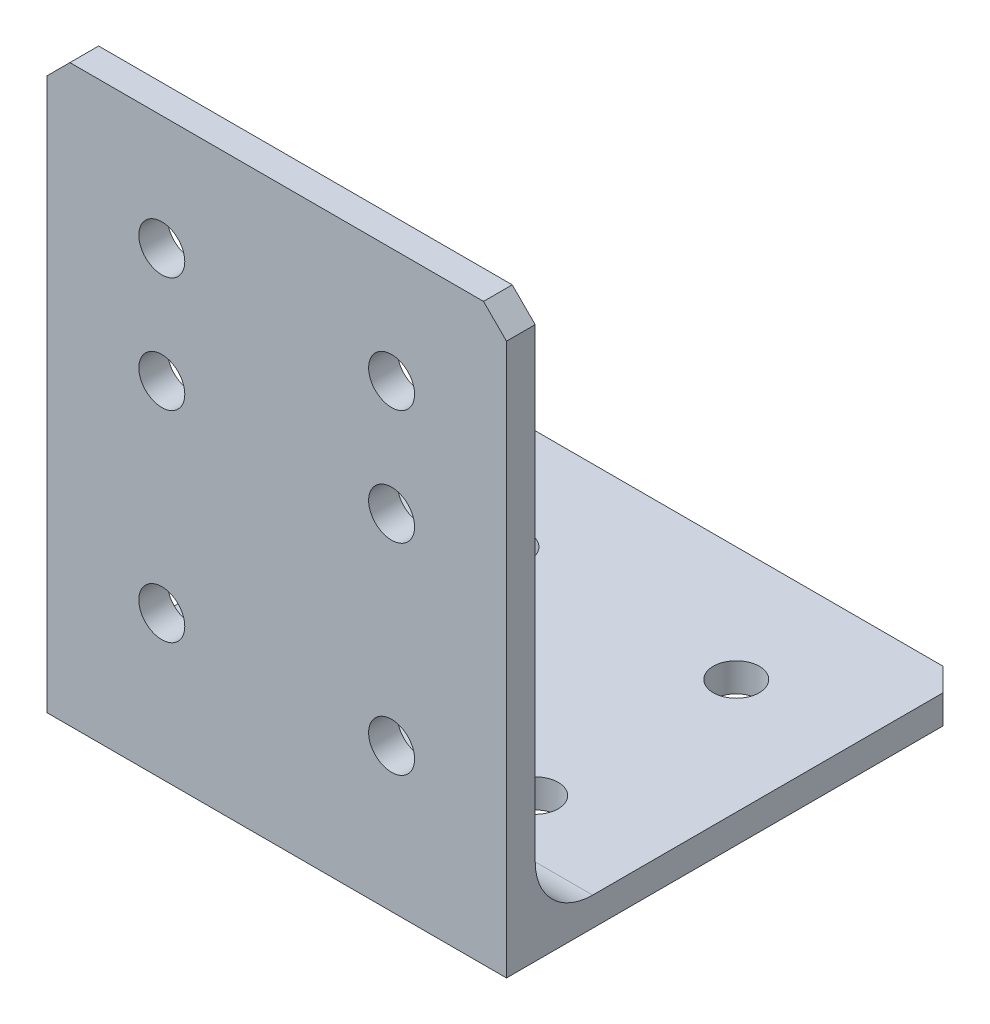
ISO-10303-21;
HEADER;
FILE_DESCRIPTION(('STEP AP214'),'2;1');
FILE_NAME('part.step','',(''),(''),'','','');
FILE_SCHEMA(('AUTOMOTIVE_DESIGN { 1 0 10303 214 1 1 1 1 }'));
ENDSEC;
DATA;
#1=APPLICATION_CONTEXT('core data for automotive mechanical design processes');
#2=APPLICATION_PROTOCOL_DEFINITION('international standard','automotive_design',2000,#1);
#3=PRODUCT_CONTEXT('',#1,'mechanical');
#4=PRODUCT('Part','Part','',(#3));
#5=PRODUCT_RELATED_PRODUCT_CATEGORY('part','',(#4));
#6=PRODUCT_DEFINITION_FORMATION('','',#4);
#7=PRODUCT_DEFINITION_CONTEXT('part definition',#1,'design');
#8=PRODUCT_DEFINITION('design','',#6,#7);
#9=PRODUCT_DEFINITION_SHAPE('','',#8);
#10=(LENGTH_UNIT() NAMED_UNIT(*) SI_UNIT(.MILLI.,.METRE.));
#11=(NAMED_UNIT(*) PLANE_ANGLE_UNIT() SI_UNIT($,.RADIAN.));
#12=(NAMED_UNIT(*) SI_UNIT($,.STERADIAN.) SOLID_ANGLE_UNIT());
#13=UNCERTAINTY_MEASURE_WITH_UNIT(LENGTH_MEASURE(1.E-05),#10,'distance_accuracy_value','');
#14=(GEOMETRIC_REPRESENTATION_CONTEXT(3) GLOBAL_UNCERTAINTY_ASSIGNED_CONTEXT((#13)) GLOBAL_UNIT_ASSIGNED_CONTEXT((#10,
#11,#12)) REPRESENTATION_CONTEXT('',''));
#15=CARTESIAN_POINT('',(0.,0.,0.));
#16=DIRECTION('',(0.,0.,1.));
#17=DIRECTION('',(1.,0.,0.));
#18=AXIS2_PLACEMENT_3D('',#15,#16,#17);
#19=CARTESIAN_POINT('',(50.8,0.,-50.8));
#20=DIRECTION('',(0.,1.,0.));
#21=DIRECTION('',(0.,0.,1.));
#22=AXIS2_PLACEMENT_3D('',#19,#20,#21);
#23=PLANE('',#22);
#24=CARTESIAN_POINT('',(38.1,0.,-15.875));
#25=DIRECTION('',(0.,-1.,0.));
#26=DIRECTION('',(0.,0.,-1.));
#27=AXIS2_PLACEMENT_3D('',#24,#25,#26);
#28=CIRCLE('',#27,2.54);
#29=CARTESIAN_POINT('',(38.1,0.,-18.415));
#30=VERTEX_POINT('',#29);
#31=EDGE_CURVE('E344',#30,#30,#28,.T.);
#32=ORIENTED_EDGE('',*,*,#31,.F.);
#33=EDGE_LOOP('',(#32));
#34=FACE_BOUND('',#33,.T.);
#35=CARTESIAN_POINT('',(12.7,0.,-38.1));
#36=DIRECTION('',(0.,-1.,0.));
#37=DIRECTION('',(0.,0.,-1.));
#38=AXIS2_PLACEMENT_3D('',#35,#36,#37);
#39=CIRCLE('',#38,2.54);
#40=CARTESIAN_POINT('',(12.7,0.,-40.64));
#41=VERTEX_POINT('',#40);
#42=EDGE_CURVE('E341',#41,#41,#39,.T.);
#43=ORIENTED_EDGE('',*,*,#42,.F.);
#44=EDGE_LOOP('',(#43));
#45=FACE_BOUND('',#44,.T.);
#46=CARTESIAN_POINT('',(12.7,0.,-15.875));
#47=DIRECTION('',(0.,-1.,0.));
#48=DIRECTION('',(0.,0.,-1.));
#49=AXIS2_PLACEMENT_3D('',#46,#47,#48);
#50=CIRCLE('',#49,2.54);
#51=CARTESIAN_POINT('',(12.7,0.,-18.415));
#52=VERTEX_POINT('',#51);
#53=EDGE_CURVE('E334',#52,#52,#50,.T.);
#54=ORIENTED_EDGE('',*,*,#53,.F.);
#55=EDGE_LOOP('',(#54));
#56=FACE_BOUND('',#55,.T.);
#57=CARTESIAN_POINT('',(38.1,0.,-38.1));
#58=DIRECTION('',(0.,-1.,0.));
#59=DIRECTION('',(0.,0.,-1.));
#60=AXIS2_PLACEMENT_3D('',#57,#58,#59);
#61=CIRCLE('',#60,2.54);
#62=CARTESIAN_POINT('',(38.1,0.,-40.64));
#63=VERTEX_POINT('',#62);
#64=EDGE_CURVE('E176',#63,#63,#61,.T.);
#65=ORIENTED_EDGE('',*,*,#64,.F.);
#66=EDGE_LOOP('',(#65));
#67=FACE_BOUND('',#66,.T.);
#68=DIRECTION('',(-1.,0.,0.));
#69=VECTOR('',#68,1.);
#70=CARTESIAN_POINT('',(50.8,0.,-50.8));
#71=LINE('',#70,#69);
#72=CARTESIAN_POINT('',(48.26,0.,-50.8));
#73=VERTEX_POINT('',#72);
#74=CARTESIAN_POINT('',(2.54,0.,-50.8));
#75=VERTEX_POINT('',#74);
#76=EDGE_CURVE('E169',#73,#75,#71,.T.);
#77=ORIENTED_EDGE('',*,*,#76,.F.);
#78=DIRECTION('',(-0.707106781186549,0.,-0.707106781186546));
#79=VECTOR('',#78,1.);
#80=CARTESIAN_POINT('',(50.8,0.,-48.26));
#81=LINE('',#80,#79);
#82=CARTESIAN_POINT('',(50.8,0.,-48.26));
#83=VERTEX_POINT('',#82);
#84=EDGE_CURVE('E11',#73,#83,#81,.F.);
#85=ORIENTED_EDGE('',*,*,#84,.T.);
#86=DIRECTION('',(0.,0.,-1.));
#87=VECTOR('',#86,1.);
#88=CARTESIAN_POINT('',(50.8,0.,-50.8));
#89=LINE('',#88,#87);
#90=CARTESIAN_POINT('',(50.8,0.,0.));
#91=VERTEX_POINT('',#90);
#92=EDGE_CURVE('E129',#91,#83,#89,.T.);
#93=ORIENTED_EDGE('',*,*,#92,.F.);
#94=DIRECTION('',(-1.,0.,0.));
#95=VECTOR('',#94,1.);
#96=CARTESIAN_POINT('',(50.8,0.,0.));
#97=LINE('',#96,#95);
#98=CARTESIAN_POINT('',(0.,0.,0.));
#99=VERTEX_POINT('',#98);
#100=EDGE_CURVE('E134',#91,#99,#97,.T.);
#101=ORIENTED_EDGE('',*,*,#100,.T.);
#102=DIRECTION('',(0.,0.,-1.));
#103=VECTOR('',#102,1.);
#104=CARTESIAN_POINT('',(0.,0.,-50.8));
#105=LINE('',#104,#103);
#106=CARTESIAN_POINT('',(0.,0.,-48.26));
#107=VERTEX_POINT('',#106);
#108=EDGE_CURVE('E155',#99,#107,#105,.T.);
#109=ORIENTED_EDGE('',*,*,#108,.T.);
#110=DIRECTION('',(0.707106781186546,0.,-0.70710678118655));
#111=VECTOR('',#110,1.);
#112=CARTESIAN_POINT('',(2.54,0.,-50.8));
#113=LINE('',#112,#111);
#114=EDGE_CURVE('E47',#107,#75,#113,.T.);
#115=ORIENTED_EDGE('',*,*,#114,.T.);
#116=EDGE_LOOP('',(#77,#85,#93,#101,#109,#115));
#117=FACE_BOUND('',#116,.T.);
#118=ADVANCED_FACE('F38',(#34,#45,#56,#67,#117),#23,.F.);
#119=CARTESIAN_POINT('',(50.8,3.175,-50.8));
#120=DIRECTION('',(0.,0.,1.));
#121=DIRECTION('',(1.,0.,0.));
#122=AXIS2_PLACEMENT_3D('',#119,#120,#121);
#123=PLANE('',#122);
#124=DIRECTION('',(-1.,0.,0.));
#125=VECTOR('',#124,1.);
#126=CARTESIAN_POINT('',(50.8,3.175,-50.8));
#127=LINE('',#126,#125);
#128=CARTESIAN_POINT('',(48.26,3.175,-50.8));
#129=VERTEX_POINT('',#128);
#130=CARTESIAN_POINT('',(2.54,3.175,-50.8));
#131=VERTEX_POINT('',#130);
#132=EDGE_CURVE('E166',#129,#131,#127,.T.);
#133=ORIENTED_EDGE('',*,*,#132,.F.);
#134=DIRECTION('',(0.,-1.,0.));
#135=VECTOR('',#134,1.);
#136=CARTESIAN_POINT('',(48.26,3.175,-50.8));
#137=LINE('',#136,#135);
#138=EDGE_CURVE('E60',#129,#73,#137,.T.);
#139=ORIENTED_EDGE('',*,*,#138,.T.);
#140=ORIENTED_EDGE('',*,*,#76,.T.);
#141=DIRECTION('',(0.,1.,0.));
#142=VECTOR('',#141,1.);
#143=CARTESIAN_POINT('',(2.54,3.175,-50.8));
#144=LINE('',#143,#142);
#145=EDGE_CURVE('E220',#75,#131,#144,.T.);
#146=ORIENTED_EDGE('',*,*,#145,.T.);
#147=EDGE_LOOP('',(#133,#139,#140,#146));
#148=FACE_BOUND('',#147,.T.);
#149=ADVANCED_FACE('F224',(#148),#123,.F.);
#150=CARTESIAN_POINT('',(50.8,3.175,-3.17500000000001));
#151=DIRECTION('',(0.,-1.,0.));
#152=DIRECTION('',(0.,0.,-1.));
#153=AXIS2_PLACEMENT_3D('',#150,#151,#152);
#154=PLANE('',#153);
#155=CARTESIAN_POINT('',(38.1,3.175,-15.875));
#156=DIRECTION('',(0.,-1.,0.));
#157=DIRECTION('',(0.,0.,-1.));
#158=AXIS2_PLACEMENT_3D('',#155,#156,#157);
#159=CIRCLE('',#158,2.54);
#160=CARTESIAN_POINT('',(38.1,3.175,-18.415));
#161=VERTEX_POINT('',#160);
#162=EDGE_CURVE('E182',#161,#161,#159,.T.);
#163=ORIENTED_EDGE('',*,*,#162,.T.);
#164=EDGE_LOOP('',(#163));
#165=FACE_BOUND('',#164,.T.);
#166=CARTESIAN_POINT('',(12.7,3.175,-38.1));
#167=DIRECTION('',(0.,-1.,0.));
#168=DIRECTION('',(0.,0.,-1.));
#169=AXIS2_PLACEMENT_3D('',#166,#167,#168);
#170=CIRCLE('',#169,2.54);
#171=CARTESIAN_POINT('',(12.7,3.175,-40.64));
#172=VERTEX_POINT('',#171);
#173=EDGE_CURVE('E179',#172,#172,#170,.T.);
#174=ORIENTED_EDGE('',*,*,#173,.T.);
#175=EDGE_LOOP('',(#174));
#176=FACE_BOUND('',#175,.T.);
#177=CARTESIAN_POINT('',(12.7,3.175,-15.875));
#178=DIRECTION('',(0.,-1.,0.));
#179=DIRECTION('',(0.,0.,-1.));
#180=AXIS2_PLACEMENT_3D('',#177,#178,#179);
#181=CIRCLE('',#180,2.54);
#182=CARTESIAN_POINT('',(12.7,3.175,-18.415));
#183=VERTEX_POINT('',#182);
#184=EDGE_CURVE('E175',#183,#183,#181,.T.);
#185=ORIENTED_EDGE('',*,*,#184,.T.);
#186=EDGE_LOOP('',(#185));
#187=FACE_BOUND('',#186,.T.);
#188=CARTESIAN_POINT('',(38.1,3.175,-38.1));
#189=DIRECTION('',(0.,-1.,0.));
#190=DIRECTION('',(0.,0.,-1.));
#191=AXIS2_PLACEMENT_3D('',#188,#189,#190);
#192=CIRCLE('',#191,2.54);
#193=CARTESIAN_POINT('',(38.1,3.175,-40.64));
#194=VERTEX_POINT('',#193);
#195=EDGE_CURVE('E172',#194,#194,#192,.T.);
#196=ORIENTED_EDGE('',*,*,#195,.T.);
#197=EDGE_LOOP('',(#196));
#198=FACE_BOUND('',#197,.T.);
#199=DIRECTION('',(0.,0.,1.));
#200=VECTOR('',#199,1.);
#201=CARTESIAN_POINT('',(50.8,3.175,-3.17500000000001));
#202=LINE('',#201,#200);
#203=CARTESIAN_POINT('',(50.8,3.175,-48.26));
#204=VERTEX_POINT('',#203);
#205=CARTESIAN_POINT('',(50.8,3.175,-9.525));
#206=VERTEX_POINT('',#205);
#207=EDGE_CURVE('E145',#204,#206,#202,.T.);
#208=ORIENTED_EDGE('',*,*,#207,.F.);
#209=DIRECTION('',(0.707106781186549,0.,0.707106781186546));
#210=VECTOR('',#209,1.);
#211=CARTESIAN_POINT('',(50.8,3.175,-48.26));
#212=LINE('',#211,#210);
#213=EDGE_CURVE('E218',#204,#129,#212,.F.);
#214=ORIENTED_EDGE('',*,*,#213,.T.);
#215=ORIENTED_EDGE('',*,*,#132,.T.);
#216=DIRECTION('',(-0.707106781186546,0.,0.70710678118655));
#217=VECTOR('',#216,1.);
#218=CARTESIAN_POINT('',(2.54,3.175,-50.8));
#219=LINE('',#218,#217);
#220=CARTESIAN_POINT('',(0.,3.175,-48.26));
#221=VERTEX_POINT('',#220);
#222=EDGE_CURVE('E216',#131,#221,#219,.T.);
#223=ORIENTED_EDGE('',*,*,#222,.T.);
#224=DIRECTION('',(0.,0.,1.));
#225=VECTOR('',#224,1.);
#226=CARTESIAN_POINT('',(0.,3.175,-3.17500000000001));
#227=LINE('',#226,#225);
#228=CARTESIAN_POINT('',(0.,3.175,-9.525));
#229=VERTEX_POINT('',#228);
#230=EDGE_CURVE('E157',#221,#229,#227,.T.);
#231=ORIENTED_EDGE('',*,*,#230,.T.);
#232=DIRECTION('',(-1.,0.,0.));
#233=VECTOR('',#232,1.);
#234=CARTESIAN_POINT('',(50.8,3.175,-9.525));
#235=LINE('',#234,#233);
#236=EDGE_CURVE('E188',#229,#206,#235,.F.);
#237=ORIENTED_EDGE('',*,*,#236,.T.);
#238=EDGE_LOOP('',(#208,#214,#215,#223,#231,#237));
#239=FACE_BOUND('',#238,.T.);
#240=ADVANCED_FACE('F228',(#165,#176,#187,#198,#239),#154,.F.);
#241=CARTESIAN_POINT('',(50.8,63.5,-3.175));
#242=DIRECTION('',(0.,0.,1.));
#243=DIRECTION('',(0.,-1.,0.));
#244=AXIS2_PLACEMENT_3D('',#241,#242,#243);
#245=PLANE('',#244);
#246=CARTESIAN_POINT('',(38.1,15.875,-3.175));
#247=DIRECTION('',(0.,0.,1.));
#248=DIRECTION('',(0.,-1.,0.));
#249=AXIS2_PLACEMENT_3D('',#246,#247,#248);
#250=CIRCLE('',#249,2.54);
#251=CARTESIAN_POINT('',(38.1,13.335,-3.175));
#252=VERTEX_POINT('',#251);
#253=EDGE_CURVE('E151',#252,#252,#250,.T.);
#254=ORIENTED_EDGE('',*,*,#253,.T.);
#255=EDGE_LOOP('',(#254));
#256=FACE_BOUND('',#255,.T.);
#257=CARTESIAN_POINT('',(12.7,50.8,-3.175));
#258=DIRECTION('',(0.,0.,1.));
#259=DIRECTION('',(0.,-1.,0.));
#260=AXIS2_PLACEMENT_3D('',#257,#258,#259);
#261=CIRCLE('',#260,2.54);
#262=CARTESIAN_POINT('',(12.7,48.26,-3.175));
#263=VERTEX_POINT('',#262);
#264=EDGE_CURVE('E379',#263,#263,#261,.T.);
#265=ORIENTED_EDGE('',*,*,#264,.T.);
#266=EDGE_LOOP('',(#265));
#267=FACE_BOUND('',#266,.T.);
#268=CARTESIAN_POINT('',(38.1,50.8,-3.175));
#269=DIRECTION('',(0.,0.,1.));
#270=DIRECTION('',(0.,-1.,0.));
#271=AXIS2_PLACEMENT_3D('',#268,#269,#270);
#272=CIRCLE('',#271,2.54);
#273=CARTESIAN_POINT('',(38.1,48.26,-3.175));
#274=VERTEX_POINT('',#273);
#275=EDGE_CURVE('E377',#274,#274,#272,.T.);
#276=ORIENTED_EDGE('',*,*,#275,.T.);
#277=EDGE_LOOP('',(#276));
#278=FACE_BOUND('',#277,.T.);
#279=CARTESIAN_POINT('',(12.7,15.875,-3.175));
#280=DIRECTION('',(0.,0.,1.));
#281=DIRECTION('',(0.,-1.,0.));
#282=AXIS2_PLACEMENT_3D('',#279,#280,#281);
#283=CIRCLE('',#282,2.54);
#284=CARTESIAN_POINT('',(12.7,13.335,-3.175));
#285=VERTEX_POINT('',#284);
#286=EDGE_CURVE('E374',#285,#285,#283,.T.);
#287=ORIENTED_EDGE('',*,*,#286,.T.);
#288=EDGE_LOOP('',(#287));
#289=FACE_BOUND('',#288,.T.);
#290=CARTESIAN_POINT('',(38.1,38.1,-3.175));
#291=DIRECTION('',(0.,0.,1.));
#292=DIRECTION('',(0.,-1.,0.));
#293=AXIS2_PLACEMENT_3D('',#290,#291,#292);
#294=CIRCLE('',#293,2.54);
#295=CARTESIAN_POINT('',(38.1,35.56,-3.175));
#296=VERTEX_POINT('',#295);
#297=EDGE_CURVE('E371',#296,#296,#294,.T.);
#298=ORIENTED_EDGE('',*,*,#297,.T.);
#299=EDGE_LOOP('',(#298));
#300=FACE_BOUND('',#299,.T.);
#301=CARTESIAN_POINT('',(12.7,38.1,-3.175));
#302=DIRECTION('',(0.,0.,1.));
#303=DIRECTION('',(0.,-1.,0.));
#304=AXIS2_PLACEMENT_3D('',#301,#302,#303);
#305=CIRCLE('',#304,2.54);
#306=CARTESIAN_POINT('',(12.7,35.56,-3.175));
#307=VERTEX_POINT('',#306);
#308=EDGE_CURVE('E368',#307,#307,#305,.T.);
#309=ORIENTED_EDGE('',*,*,#308,.T.);
#310=EDGE_LOOP('',(#309));
#311=FACE_BOUND('',#310,.T.);
#312=DIRECTION('',(-1.,0.,0.));
#313=VECTOR('',#312,1.);
#314=CARTESIAN_POINT('',(50.8,63.5,-3.175));
#315=LINE('',#314,#313);
#316=CARTESIAN_POINT('',(48.26,63.5,-3.175));
#317=VERTEX_POINT('',#316);
#318=CARTESIAN_POINT('',(2.54,63.5,-3.175));
#319=VERTEX_POINT('',#318);
#320=EDGE_CURVE('E163',#317,#319,#315,.T.);
#321=ORIENTED_EDGE('',*,*,#320,.F.);
#322=DIRECTION('',(-0.707106781186549,0.707106781186546,0.));
#323=VECTOR('',#322,1.);
#324=CARTESIAN_POINT('',(50.8,60.96,-3.175));
#325=LINE('',#324,#323);
#326=CARTESIAN_POINT('',(50.8,60.96,-3.175));
#327=VERTEX_POINT('',#326);
#328=EDGE_CURVE('E210',#317,#327,#325,.F.);
#329=ORIENTED_EDGE('',*,*,#328,.T.);
#330=DIRECTION('',(0.,1.,0.));
#331=VECTOR('',#330,1.);
#332=CARTESIAN_POINT('',(50.8,63.5,-3.175));
#333=LINE('',#332,#331);
#334=CARTESIAN_POINT('',(50.8,9.525,-3.17500000000001));
#335=VERTEX_POINT('',#334);
#336=EDGE_CURVE('E135',#335,#327,#333,.T.);
#337=ORIENTED_EDGE('',*,*,#336,.F.);
#338=DIRECTION('',(-1.,0.,0.));
#339=VECTOR('',#338,1.);
#340=CARTESIAN_POINT('',(0.,9.525,-3.17500000000001));
#341=LINE('',#340,#339);
#342=CARTESIAN_POINT('',(0.,9.525,-3.17500000000001));
#343=VERTEX_POINT('',#342);
#344=EDGE_CURVE('E171',#335,#343,#341,.T.);
#345=ORIENTED_EDGE('',*,*,#344,.T.);
#346=DIRECTION('',(0.,1.,0.));
#347=VECTOR('',#346,1.);
#348=CARTESIAN_POINT('',(0.,63.5,-3.175));
#349=LINE('',#348,#347);
#350=CARTESIAN_POINT('',(0.,60.96,-3.175));
#351=VERTEX_POINT('',#350);
#352=EDGE_CURVE('E148',#343,#351,#349,.T.);
#353=ORIENTED_EDGE('',*,*,#352,.T.);
#354=DIRECTION('',(0.707106781186546,0.70710678118655,0.));
#355=VECTOR('',#354,1.);
#356=CARTESIAN_POINT('',(2.54,63.5,-3.175));
#357=LINE('',#356,#355);
#358=EDGE_CURVE('E208',#351,#319,#357,.T.);
#359=ORIENTED_EDGE('',*,*,#358,.T.);
#360=EDGE_LOOP('',(#321,#329,#337,#345,#353,#359));
#361=FACE_BOUND('',#360,.T.);
#362=ADVANCED_FACE('F241',(#256,#267,#278,#289,#300,#311,#361),#245,.F.);
#363=CARTESIAN_POINT('',(50.8,63.5,0.));
#364=DIRECTION('',(0.,-1.,0.));
#365=DIRECTION('',(0.,0.,-1.));
#366=AXIS2_PLACEMENT_3D('',#363,#364,#365);
#367=PLANE('',#366);
#368=DIRECTION('',(-1.,0.,0.));
#369=VECTOR('',#368,1.);
#370=CARTESIAN_POINT('',(50.8,63.5,0.));
#371=LINE('',#370,#369);
#372=CARTESIAN_POINT('',(48.26,63.5,0.));
#373=VERTEX_POINT('',#372);
#374=CARTESIAN_POINT('',(2.54,63.5,0.));
#375=VERTEX_POINT('',#374);
#376=EDGE_CURVE('E142',#373,#375,#371,.T.);
#377=ORIENTED_EDGE('',*,*,#376,.F.);
#378=DIRECTION('',(0.,0.,-1.));
#379=VECTOR('',#378,1.);
#380=CARTESIAN_POINT('',(48.26,63.5,0.));
#381=LINE('',#380,#379);
#382=EDGE_CURVE('E206',#373,#317,#381,.T.);
#383=ORIENTED_EDGE('',*,*,#382,.T.);
#384=ORIENTED_EDGE('',*,*,#320,.T.);
#385=DIRECTION('',(0.,0.,1.));
#386=VECTOR('',#385,1.);
#387=CARTESIAN_POINT('',(2.54,63.5,0.));
#388=LINE('',#387,#386);
#389=EDGE_CURVE('E203',#319,#375,#388,.T.);
#390=ORIENTED_EDGE('',*,*,#389,.T.);
#391=EDGE_LOOP('',(#377,#383,#384,#390));
#392=FACE_BOUND('',#391,.T.);
#393=ADVANCED_FACE('F252',(#392),#367,.F.);
#394=CARTESIAN_POINT('',(50.8,0.,0.));
#395=DIRECTION('',(0.,0.,-1.));
#396=DIRECTION('',(-1.,0.,0.));
#397=AXIS2_PLACEMENT_3D('',#394,#395,#396);
#398=PLANE('',#397);
#399=CARTESIAN_POINT('',(38.1,15.875,0.));
#400=DIRECTION('',(0.,0.,1.));
#401=DIRECTION('',(-1.,0.,0.));
#402=AXIS2_PLACEMENT_3D('',#399,#400,#401);
#403=CIRCLE('',#402,2.54);
#404=CARTESIAN_POINT('',(35.56,15.875,0.));
#405=VERTEX_POINT('',#404);
#406=EDGE_CURVE('E353',#405,#405,#403,.T.);
#407=ORIENTED_EDGE('',*,*,#406,.F.);
#408=EDGE_LOOP('',(#407));
#409=FACE_BOUND('',#408,.T.);
#410=CARTESIAN_POINT('',(12.7,50.8,0.));
#411=DIRECTION('',(0.,0.,1.));
#412=DIRECTION('',(1.,0.,0.));
#413=AXIS2_PLACEMENT_3D('',#410,#411,#412);
#414=CIRCLE('',#413,2.54);
#415=CARTESIAN_POINT('',(15.24,50.8,0.));
#416=VERTEX_POINT('',#415);
#417=EDGE_CURVE('E354',#416,#416,#414,.T.);
#418=ORIENTED_EDGE('',*,*,#417,.F.);
#419=EDGE_LOOP('',(#418));
#420=FACE_BOUND('',#419,.T.);
#421=CARTESIAN_POINT('',(38.1,50.8,0.));
#422=DIRECTION('',(0.,0.,1.));
#423=DIRECTION('',(-1.,0.,0.));
#424=AXIS2_PLACEMENT_3D('',#421,#422,#423);
#425=CIRCLE('',#424,2.54);
#426=CARTESIAN_POINT('',(35.56,50.8,0.));
#427=VERTEX_POINT('',#426);
#428=EDGE_CURVE('E357',#427,#427,#425,.T.);
#429=ORIENTED_EDGE('',*,*,#428,.F.);
#430=EDGE_LOOP('',(#429));
#431=FACE_BOUND('',#430,.T.);
#432=CARTESIAN_POINT('',(12.7,15.875,0.));
#433=DIRECTION('',(0.,0.,1.));
#434=DIRECTION('',(1.,0.,0.));
#435=AXIS2_PLACEMENT_3D('',#432,#433,#434);
#436=CIRCLE('',#435,2.54);
#437=CARTESIAN_POINT('',(15.24,15.875,0.));
#438=VERTEX_POINT('',#437);
#439=EDGE_CURVE('E360',#438,#438,#436,.T.);
#440=ORIENTED_EDGE('',*,*,#439,.F.);
#441=EDGE_LOOP('',(#440));
#442=FACE_BOUND('',#441,.T.);
#443=CARTESIAN_POINT('',(38.1,38.1,0.));
#444=DIRECTION('',(0.,0.,1.));
#445=DIRECTION('',(-1.,0.,0.));
#446=AXIS2_PLACEMENT_3D('',#443,#444,#445);
#447=CIRCLE('',#446,2.54);
#448=CARTESIAN_POINT('',(35.56,38.1,0.));
#449=VERTEX_POINT('',#448);
#450=EDGE_CURVE('E185',#449,#449,#447,.T.);
#451=ORIENTED_EDGE('',*,*,#450,.F.);
#452=EDGE_LOOP('',(#451));
#453=FACE_BOUND('',#452,.T.);
#454=CARTESIAN_POINT('',(12.7,38.1,0.));
#455=DIRECTION('',(0.,0.,1.));
#456=DIRECTION('',(1.,0.,0.));
#457=AXIS2_PLACEMENT_3D('',#454,#455,#456);
#458=CIRCLE('',#457,2.54);
#459=CARTESIAN_POINT('',(15.24,38.1,0.));
#460=VERTEX_POINT('',#459);
#461=EDGE_CURVE('E363',#460,#460,#458,.T.);
#462=ORIENTED_EDGE('',*,*,#461,.F.);
#463=EDGE_LOOP('',(#462));
#464=FACE_BOUND('',#463,.T.);
#465=DIRECTION('',(0.,-1.,0.));
#466=VECTOR('',#465,1.);
#467=CARTESIAN_POINT('',(50.8,0.,0.));
#468=LINE('',#467,#466);
#469=CARTESIAN_POINT('',(50.8,60.96,0.));
#470=VERTEX_POINT('',#469);
#471=EDGE_CURVE('E123',#470,#91,#468,.T.);
#472=ORIENTED_EDGE('',*,*,#471,.F.);
#473=DIRECTION('',(0.707106781186549,-0.707106781186546,0.));
#474=VECTOR('',#473,1.);
#475=CARTESIAN_POINT('',(50.8,60.96,0.));
#476=LINE('',#475,#474);
#477=EDGE_CURVE('E201',#470,#373,#476,.F.);
#478=ORIENTED_EDGE('',*,*,#477,.T.);
#479=ORIENTED_EDGE('',*,*,#376,.T.);
#480=DIRECTION('',(-0.707106781186546,-0.70710678118655,0.));
#481=VECTOR('',#480,1.);
#482=CARTESIAN_POINT('',(2.54,63.5,0.));
#483=LINE('',#482,#481);
#484=CARTESIAN_POINT('',(0.,60.96,0.));
#485=VERTEX_POINT('',#484);
#486=EDGE_CURVE('E199',#375,#485,#483,.T.);
#487=ORIENTED_EDGE('',*,*,#486,.T.);
#488=DIRECTION('',(0.,-1.,0.));
#489=VECTOR('',#488,1.);
#490=CARTESIAN_POINT('',(0.,0.,0.));
#491=LINE('',#490,#489);
#492=EDGE_CURVE('E140',#485,#99,#491,.T.);
#493=ORIENTED_EDGE('',*,*,#492,.T.);
#494=ORIENTED_EDGE('',*,*,#100,.F.);
#495=EDGE_LOOP('',(#472,#478,#479,#487,#493,#494));
#496=FACE_BOUND('',#495,.T.);
#497=ADVANCED_FACE('F138',(#409,#420,#431,#442,#453,#464,#496),#398,.F.);
#498=CARTESIAN_POINT('',(50.8,0.,0.));
#499=DIRECTION('',(-1.,0.,0.));
#500=DIRECTION('',(0.,0.,1.));
#501=AXIS2_PLACEMENT_3D('',#498,#499,#500);
#502=PLANE('',#501);
#503=ORIENTED_EDGE('',*,*,#336,.T.);
#504=DIRECTION('',(0.,0.,1.));
#505=VECTOR('',#504,1.);
#506=CARTESIAN_POINT('',(50.8,60.96,0.));
#507=LINE('',#506,#505);
#508=EDGE_CURVE('E132',#327,#470,#507,.T.);
#509=ORIENTED_EDGE('',*,*,#508,.T.);
#510=ORIENTED_EDGE('',*,*,#471,.T.);
#511=ORIENTED_EDGE('',*,*,#92,.T.);
#512=DIRECTION('',(0.,1.,0.));
#513=VECTOR('',#512,1.);
#514=CARTESIAN_POINT('',(50.8,0.,-48.26));
#515=LINE('',#514,#513);
#516=EDGE_CURVE('E196',#83,#204,#515,.T.);
#517=ORIENTED_EDGE('',*,*,#516,.T.);
#518=ORIENTED_EDGE('',*,*,#207,.T.);
#519=CARTESIAN_POINT('',(50.8,9.525,-9.525));
#520=DIRECTION('',(-1.,0.,0.));
#521=DIRECTION('',(0.,0.,1.));
#522=AXIS2_PLACEMENT_3D('',#519,#520,#521);
#523=CIRCLE('',#522,6.35);
#524=EDGE_CURVE('E194',#206,#335,#523,.T.);
#525=ORIENTED_EDGE('',*,*,#524,.T.);
#526=EDGE_LOOP('',(#503,#509,#510,#511,#517,#518,#525));
#527=FACE_BOUND('',#526,.T.);
#528=ADVANCED_FACE('F126',(#527),#502,.F.);
#529=CARTESIAN_POINT('',(0.,0.,0.));
#530=DIRECTION('',(-1.,0.,0.));
#531=DIRECTION('',(0.,0.,1.));
#532=AXIS2_PLACEMENT_3D('',#529,#530,#531);
#533=PLANE('',#532);
#534=ORIENTED_EDGE('',*,*,#492,.F.);
#535=DIRECTION('',(0.,0.,-1.));
#536=VECTOR('',#535,1.);
#537=CARTESIAN_POINT('',(0.,60.96,-3.175));
#538=LINE('',#537,#536);
#539=EDGE_CURVE('E214',#485,#351,#538,.T.);
#540=ORIENTED_EDGE('',*,*,#539,.T.);
#541=ORIENTED_EDGE('',*,*,#352,.F.);
#542=CARTESIAN_POINT('',(0.,9.525,-9.525));
#543=DIRECTION('',(-1.,0.,0.));
#544=DIRECTION('',(0.,0.,1.));
#545=AXIS2_PLACEMENT_3D('',#542,#543,#544);
#546=CIRCLE('',#545,6.35);
#547=EDGE_CURVE('E191',#343,#229,#546,.F.);
#548=ORIENTED_EDGE('',*,*,#547,.T.);
#549=ORIENTED_EDGE('',*,*,#230,.F.);
#550=DIRECTION('',(0.,-1.,0.));
#551=VECTOR('',#550,1.);
#552=CARTESIAN_POINT('',(0.,0.,-48.26));
#553=LINE('',#552,#551);
#554=EDGE_CURVE('E212',#221,#107,#553,.T.);
#555=ORIENTED_EDGE('',*,*,#554,.T.);
#556=ORIENTED_EDGE('',*,*,#108,.F.);
#557=EDGE_LOOP('',(#534,#540,#541,#548,#549,#555,#556));
#558=FACE_BOUND('',#557,.T.);
#559=ADVANCED_FACE('F244',(#558),#533,.T.);
#560=CARTESIAN_POINT('',(12.7,38.1,-50.8));
#561=DIRECTION('',(0.,0.,1.));
#562=DIRECTION('',(1.,0.,0.));
#563=AXIS2_PLACEMENT_3D('',#560,#561,#562);
#564=CYLINDRICAL_SURFACE('',#563,2.54);
#565=ORIENTED_EDGE('',*,*,#461,.T.);
#566=EDGE_LOOP('',(#565));
#567=FACE_BOUND('',#566,.T.);
#568=ORIENTED_EDGE('',*,*,#308,.F.);
#569=EDGE_LOOP('',(#568));
#570=FACE_BOUND('',#569,.T.);
#571=ADVANCED_FACE('F289',(#567,#570),#564,.F.);
#572=CARTESIAN_POINT('',(38.1,38.1,-50.8));
#573=DIRECTION('',(0.,0.,1.));
#574=DIRECTION('',(1.,0.,0.));
#575=AXIS2_PLACEMENT_3D('',#572,#573,#574);
#576=CYLINDRICAL_SURFACE('',#575,2.54);
#577=ORIENTED_EDGE('',*,*,#450,.T.);
#578=EDGE_LOOP('',(#577));
#579=FACE_BOUND('',#578,.T.);
#580=ORIENTED_EDGE('',*,*,#297,.F.);
#581=EDGE_LOOP('',(#580));
#582=FACE_BOUND('',#581,.T.);
#583=ADVANCED_FACE('F294',(#579,#582),#576,.F.);
#584=CARTESIAN_POINT('',(12.7,15.875,-50.8));
#585=DIRECTION('',(0.,0.,1.));
#586=DIRECTION('',(1.,0.,0.));
#587=AXIS2_PLACEMENT_3D('',#584,#585,#586);
#588=CYLINDRICAL_SURFACE('',#587,2.54);
#589=ORIENTED_EDGE('',*,*,#439,.T.);
#590=EDGE_LOOP('',(#589));
#591=FACE_BOUND('',#590,.T.);
#592=ORIENTED_EDGE('',*,*,#286,.F.);
#593=EDGE_LOOP('',(#592));
#594=FACE_BOUND('',#593,.T.);
#595=ADVANCED_FACE('F300',(#591,#594),#588,.F.);
#596=CARTESIAN_POINT('',(38.1,50.8,-50.8));
#597=DIRECTION('',(0.,0.,1.));
#598=DIRECTION('',(1.,0.,0.));
#599=AXIS2_PLACEMENT_3D('',#596,#597,#598);
#600=CYLINDRICAL_SURFACE('',#599,2.54);
#601=ORIENTED_EDGE('',*,*,#428,.T.);
#602=EDGE_LOOP('',(#601));
#603=FACE_BOUND('',#602,.T.);
#604=ORIENTED_EDGE('',*,*,#275,.F.);
#605=EDGE_LOOP('',(#604));
#606=FACE_BOUND('',#605,.T.);
#607=ADVANCED_FACE('F296',(#603,#606),#600,.F.);
#608=CARTESIAN_POINT('',(12.7,50.8,-50.8));
#609=DIRECTION('',(0.,0.,1.));
#610=DIRECTION('',(1.,0.,0.));
#611=AXIS2_PLACEMENT_3D('',#608,#609,#610);
#612=CYLINDRICAL_SURFACE('',#611,2.54);
#613=ORIENTED_EDGE('',*,*,#417,.T.);
#614=EDGE_LOOP('',(#613));
#615=FACE_BOUND('',#614,.T.);
#616=ORIENTED_EDGE('',*,*,#264,.F.);
#617=EDGE_LOOP('',(#616));
#618=FACE_BOUND('',#617,.T.);
#619=ADVANCED_FACE('F299',(#615,#618),#612,.F.);
#620=CARTESIAN_POINT('',(38.1,15.875,-50.8));
#621=DIRECTION('',(0.,0.,1.));
#622=DIRECTION('',(1.,0.,0.));
#623=AXIS2_PLACEMENT_3D('',#620,#621,#622);
#624=CYLINDRICAL_SURFACE('',#623,2.54);
#625=ORIENTED_EDGE('',*,*,#406,.T.);
#626=EDGE_LOOP('',(#625));
#627=FACE_BOUND('',#626,.T.);
#628=ORIENTED_EDGE('',*,*,#253,.F.);
#629=EDGE_LOOP('',(#628));
#630=FACE_BOUND('',#629,.T.);
#631=ADVANCED_FACE('F305',(#627,#630),#624,.F.);
#632=CARTESIAN_POINT('',(38.1,63.5,-38.1));
#633=DIRECTION('',(0.,-1.,0.));
#634=DIRECTION('',(0.,0.,-1.));
#635=AXIS2_PLACEMENT_3D('',#632,#633,#634);
#636=CYLINDRICAL_SURFACE('',#635,2.54);
#637=ORIENTED_EDGE('',*,*,#64,.T.);
#638=EDGE_LOOP('',(#637));
#639=FACE_BOUND('',#638,.T.);
#640=ORIENTED_EDGE('',*,*,#195,.F.);
#641=EDGE_LOOP('',(#640));
#642=FACE_BOUND('',#641,.T.);
#643=ADVANCED_FACE('F308',(#639,#642),#636,.F.);
#644=CARTESIAN_POINT('',(12.7,63.5,-15.875));
#645=DIRECTION('',(0.,-1.,0.));
#646=DIRECTION('',(0.,0.,-1.));
#647=AXIS2_PLACEMENT_3D('',#644,#645,#646);
#648=CYLINDRICAL_SURFACE('',#647,2.54);
#649=ORIENTED_EDGE('',*,*,#53,.T.);
#650=EDGE_LOOP('',(#649));
#651=FACE_BOUND('',#650,.T.);
#652=ORIENTED_EDGE('',*,*,#184,.F.);
#653=EDGE_LOOP('',(#652));
#654=FACE_BOUND('',#653,.T.);
#655=ADVANCED_FACE('F318',(#651,#654),#648,.F.);
#656=CARTESIAN_POINT('',(12.7,63.5,-38.1));
#657=DIRECTION('',(0.,-1.,0.));
#658=DIRECTION('',(0.,0.,-1.));
#659=AXIS2_PLACEMENT_3D('',#656,#657,#658);
#660=CYLINDRICAL_SURFACE('',#659,2.54);
#661=ORIENTED_EDGE('',*,*,#42,.T.);
#662=EDGE_LOOP('',(#661));
#663=FACE_BOUND('',#662,.T.);
#664=ORIENTED_EDGE('',*,*,#173,.F.);
#665=EDGE_LOOP('',(#664));
#666=FACE_BOUND('',#665,.T.);
#667=ADVANCED_FACE('F320',(#663,#666),#660,.F.);
#668=CARTESIAN_POINT('',(38.1,63.5,-15.875));
#669=DIRECTION('',(0.,-1.,0.));
#670=DIRECTION('',(0.,0.,-1.));
#671=AXIS2_PLACEMENT_3D('',#668,#669,#670);
#672=CYLINDRICAL_SURFACE('',#671,2.54);
#673=ORIENTED_EDGE('',*,*,#31,.T.);
#674=EDGE_LOOP('',(#673));
#675=FACE_BOUND('',#674,.T.);
#676=ORIENTED_EDGE('',*,*,#162,.F.);
#677=EDGE_LOOP('',(#676));
#678=FACE_BOUND('',#677,.T.);
#679=ADVANCED_FACE('F263',(#675,#678),#672,.F.);
#680=CARTESIAN_POINT('',(50.8,9.525,-9.525));
#681=DIRECTION('',(1.,0.,0.));
#682=DIRECTION('',(0.,0.,-1.));
#683=AXIS2_PLACEMENT_3D('',#680,#681,#682);
#684=CYLINDRICAL_SURFACE('',#683,6.35);
#685=ORIENTED_EDGE('',*,*,#524,.F.);
#686=ORIENTED_EDGE('',*,*,#236,.F.);
#687=ORIENTED_EDGE('',*,*,#547,.F.);
#688=ORIENTED_EDGE('',*,*,#344,.F.);
#689=EDGE_LOOP('',(#685,#686,#687,#688));
#690=FACE_BOUND('',#689,.T.);
#691=ADVANCED_FACE('F237',(#690),#684,.F.);
#692=CARTESIAN_POINT('',(50.8,60.96,0.));
#693=DIRECTION('',(-0.707106781186546,-0.707106781186549,0.));
#694=DIRECTION('',(0.,0.,1.));
#695=AXIS2_PLACEMENT_3D('',#692,#693,#694);
#696=PLANE('',#695);
#697=ORIENTED_EDGE('',*,*,#328,.F.);
#698=ORIENTED_EDGE('',*,*,#382,.F.);
#699=ORIENTED_EDGE('',*,*,#477,.F.);
#700=ORIENTED_EDGE('',*,*,#508,.F.);
#701=EDGE_LOOP('',(#697,#698,#699,#700));
#702=FACE_BOUND('',#701,.T.);
#703=ADVANCED_FACE('F255',(#702),#696,.F.);
#704=CARTESIAN_POINT('',(2.54,63.5,0.));
#705=DIRECTION('',(-0.70710678118655,0.707106781186546,0.));
#706=DIRECTION('',(0.,0.,-1.));
#707=AXIS2_PLACEMENT_3D('',#704,#705,#706);
#708=PLANE('',#707);
#709=ORIENTED_EDGE('',*,*,#358,.F.);
#710=ORIENTED_EDGE('',*,*,#539,.F.);
#711=ORIENTED_EDGE('',*,*,#486,.F.);
#712=ORIENTED_EDGE('',*,*,#389,.F.);
#713=EDGE_LOOP('',(#709,#710,#711,#712));
#714=FACE_BOUND('',#713,.T.);
#715=ADVANCED_FACE('F247',(#714),#708,.T.);
#716=CARTESIAN_POINT('',(50.8,0.,-48.26));
#717=DIRECTION('',(-0.707106781186546,0.,0.707106781186549));
#718=DIRECTION('',(0.,1.,0.));
#719=AXIS2_PLACEMENT_3D('',#716,#717,#718);
#720=PLANE('',#719);
#721=ORIENTED_EDGE('',*,*,#84,.F.);
#722=ORIENTED_EDGE('',*,*,#138,.F.);
#723=ORIENTED_EDGE('',*,*,#213,.F.);
#724=ORIENTED_EDGE('',*,*,#516,.F.);
#725=EDGE_LOOP('',(#721,#722,#723,#724));
#726=FACE_BOUND('',#725,.T.);
#727=ADVANCED_FACE('F231',(#726),#720,.F.);
#728=CARTESIAN_POINT('',(2.54,3.175,-50.8));
#729=DIRECTION('',(-0.70710678118655,0.,-0.707106781186546));
#730=DIRECTION('',(0.,-1.,0.));
#731=AXIS2_PLACEMENT_3D('',#728,#729,#730);
#732=PLANE('',#731);
#733=ORIENTED_EDGE('',*,*,#114,.F.);
#734=ORIENTED_EDGE('',*,*,#554,.F.);
#735=ORIENTED_EDGE('',*,*,#222,.F.);
#736=ORIENTED_EDGE('',*,*,#145,.F.);
#737=EDGE_LOOP('',(#733,#734,#735,#736));
#738=FACE_BOUND('',#737,.T.);
#739=ADVANCED_FACE('F41',(#738),#732,.T.);
#740=CLOSED_SHELL('',(#118,#149,#240,#362,#393,#497,#528,#559,#571,#583,#595,#607,#619,#631,
#643,#655,#667,#679,#691,#703,#715,#727,#739));
#741=MANIFOLD_SOLID_BREP('B2',#740);
#742=ADVANCED_BREP_SHAPE_REPRESENTATION('',(#18,#741),#14);
#743=SHAPE_DEFINITION_REPRESENTATION(#9,#742);
ENDSEC;
END-ISO-10303-21;
